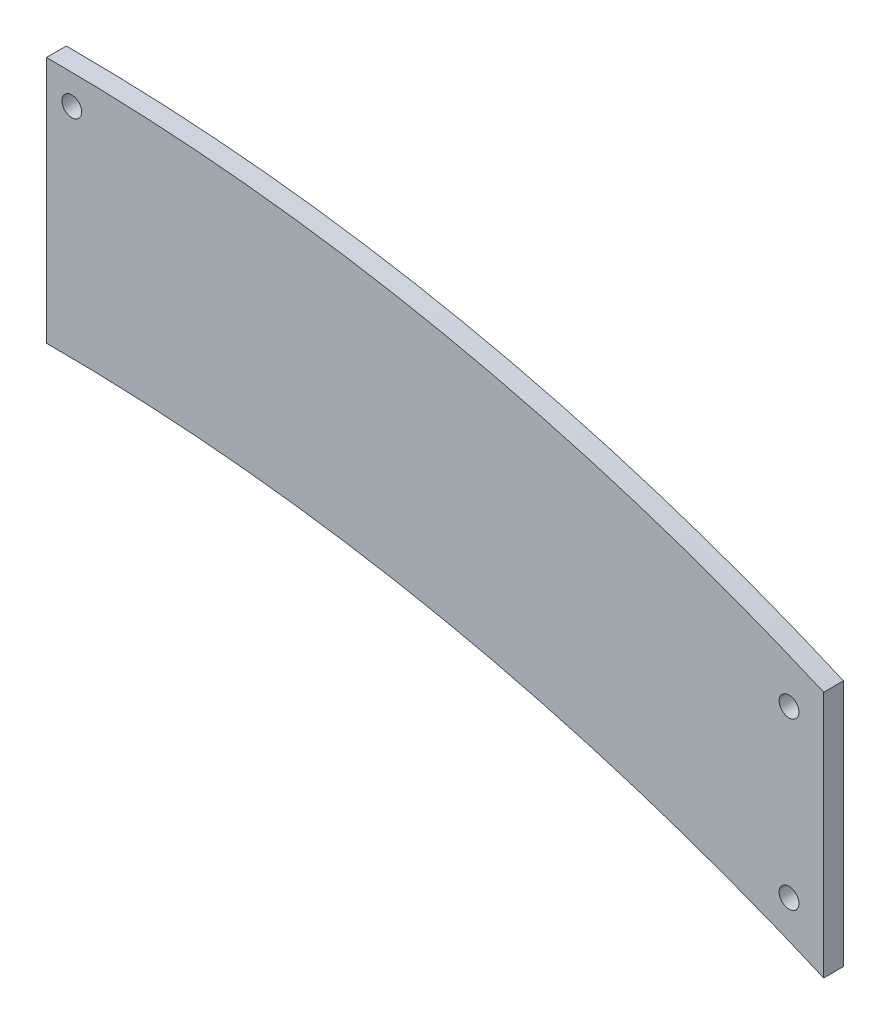
ISO-10303-21;
HEADER;
FILE_DESCRIPTION(('STEP AP214'),'2;1');
FILE_NAME('part.step','',(''),(''),'','','');
FILE_SCHEMA(('AUTOMOTIVE_DESIGN { 1 0 10303 214 1 1 1 1 }'));
ENDSEC;
DATA;
#1=APPLICATION_CONTEXT('core data for automotive mechanical design processes');
#2=APPLICATION_PROTOCOL_DEFINITION('international standard','automotive_design',2000,#1);
#3=PRODUCT_CONTEXT('',#1,'mechanical');
#4=PRODUCT('Part','Part','',(#3));
#5=PRODUCT_RELATED_PRODUCT_CATEGORY('part','',(#4));
#6=PRODUCT_DEFINITION_FORMATION('','',#4);
#7=PRODUCT_DEFINITION_CONTEXT('part definition',#1,'design');
#8=PRODUCT_DEFINITION('design','',#6,#7);
#9=PRODUCT_DEFINITION_SHAPE('','',#8);
#10=(LENGTH_UNIT() NAMED_UNIT(*) SI_UNIT(.MILLI.,.METRE.));
#11=(NAMED_UNIT(*) PLANE_ANGLE_UNIT() SI_UNIT($,.RADIAN.));
#12=(NAMED_UNIT(*) SI_UNIT($,.STERADIAN.) SOLID_ANGLE_UNIT());
#13=UNCERTAINTY_MEASURE_WITH_UNIT(LENGTH_MEASURE(1.E-05),#10,'distance_accuracy_value','');
#14=(GEOMETRIC_REPRESENTATION_CONTEXT(3) GLOBAL_UNCERTAINTY_ASSIGNED_CONTEXT((#13)) GLOBAL_UNIT_ASSIGNED_CONTEXT((#10,
#11,#12)) REPRESENTATION_CONTEXT('',''));
#15=CARTESIAN_POINT('',(0.,0.,0.));
#16=DIRECTION('',(0.,0.,1.));
#17=DIRECTION('',(1.,0.,0.));
#18=AXIS2_PLACEMENT_3D('',#15,#16,#17);
#19=CARTESIAN_POINT('',(0.,-156.923981731967,2.));
#20=DIRECTION('',(0.,0.,-1.));
#21=DIRECTION('',(-1.,0.,0.));
#22=AXIS2_PLACEMENT_3D('',#19,#20,#21);
#23=PLANE('',#22);
#24=CARTESIAN_POINT('',(75.,21.2338937231617,2.));
#25=DIRECTION('',(0.,0.,1.));
#26=DIRECTION('',(1.,0.,0.));
#27=AXIS2_PLACEMENT_3D('',#24,#25,#26);
#28=CIRCLE('',#27,0.999999999999998);
#29=CARTESIAN_POINT('',(76.,21.2338937231617,2.));
#30=VERTEX_POINT('',#29);
#31=EDGE_CURVE('E115',#30,#30,#28,.T.);
#32=ORIENTED_EDGE('',*,*,#31,.F.);
#33=EDGE_LOOP('',(#32));
#34=FACE_BOUND('',#33,.T.);
#35=CARTESIAN_POINT('',(0.,-156.923981731967,2.));
#36=DIRECTION('',(0.,0.,1.));
#37=DIRECTION('',(-1.,0.,0.));
#38=AXIS2_PLACEMENT_3D('',#35,#36,#37);
#39=CIRCLE('',#38,197.43461155384);
#40=CARTESIAN_POINT('',(78.5,24.2338937231617,2.));
#41=VERTEX_POINT('',#40);
#42=CARTESIAN_POINT('',(0.,40.5106298218736,2.));
#43=VERTEX_POINT('',#42);
#44=EDGE_CURVE('E85',#41,#43,#39,.T.);
#45=ORIENTED_EDGE('',*,*,#44,.T.);
#46=DIRECTION('',(0.,-1.,0.));
#47=VECTOR('',#46,1.);
#48=CARTESIAN_POINT('',(0.,40.5106298218736,2.));
#49=LINE('',#48,#47);
#50=CARTESIAN_POINT('',(0.,15.5106298218736,2.));
#51=VERTEX_POINT('',#50);
#52=EDGE_CURVE('E80',#43,#51,#49,.T.);
#53=ORIENTED_EDGE('',*,*,#52,.T.);
#54=CARTESIAN_POINT('',(0.,-181.923981731967,2.));
#55=DIRECTION('',(0.,0.,-1.));
#56=DIRECTION('',(-1.,0.,0.));
#57=AXIS2_PLACEMENT_3D('',#54,#55,#56);
#58=CIRCLE('',#57,197.43461155384);
#59=CARTESIAN_POINT('',(78.5,-0.766106276838346,2.));
#60=VERTEX_POINT('',#59);
#61=EDGE_CURVE('E83',#51,#60,#58,.T.);
#62=ORIENTED_EDGE('',*,*,#61,.T.);
#63=DIRECTION('',(0.,1.,0.));
#64=VECTOR('',#63,1.);
#65=CARTESIAN_POINT('',(78.5,24.2338937231617,2.));
#66=LINE('',#65,#64);
#67=EDGE_CURVE('E50',#60,#41,#66,.T.);
#68=ORIENTED_EDGE('',*,*,#67,.T.);
#69=EDGE_LOOP('',(#45,#53,#62,#68));
#70=FACE_BOUND('',#69,.T.);
#71=CARTESIAN_POINT('',(2.55518808937818,37.5106298218736,2.));
#72=DIRECTION('',(0.,0.,1.));
#73=DIRECTION('',(1.,0.,0.));
#74=AXIS2_PLACEMENT_3D('',#71,#72,#73);
#75=CIRCLE('',#74,1.);
#76=CARTESIAN_POINT('',(3.55518808937818,37.5106298218736,2.));
#77=VERTEX_POINT('',#76);
#78=EDGE_CURVE('E100',#77,#77,#75,.T.);
#79=ORIENTED_EDGE('',*,*,#78,.F.);
#80=EDGE_LOOP('',(#79));
#81=FACE_BOUND('',#80,.T.);
#82=CARTESIAN_POINT('',(75.,4.49999999999999,2.));
#83=DIRECTION('',(0.,0.,1.));
#84=DIRECTION('',(1.,0.,0.));
#85=AXIS2_PLACEMENT_3D('',#82,#83,#84);
#86=CIRCLE('',#85,0.999999999999998);
#87=CARTESIAN_POINT('',(76.,4.49999999999999,2.));
#88=VERTEX_POINT('',#87);
#89=EDGE_CURVE('E121',#88,#88,#86,.T.);
#90=ORIENTED_EDGE('',*,*,#89,.F.);
#91=EDGE_LOOP('',(#90));
#92=FACE_BOUND('',#91,.T.);
#93=ADVANCED_FACE('F33',(#34,#70,#81,#92),#23,.F.);
#94=CARTESIAN_POINT('',(0.,-156.923981731967,0.));
#95=DIRECTION('',(0.,0.,-1.));
#96=DIRECTION('',(-1.,0.,0.));
#97=AXIS2_PLACEMENT_3D('',#94,#95,#96);
#98=PLANE('',#97);
#99=CARTESIAN_POINT('',(75.,21.2338937231617,0.));
#100=DIRECTION('',(0.,0.,1.));
#101=DIRECTION('',(1.,0.,0.));
#102=AXIS2_PLACEMENT_3D('',#99,#100,#101);
#103=CIRCLE('',#102,0.999999999999998);
#104=CARTESIAN_POINT('',(76.,21.2338937231617,0.));
#105=VERTEX_POINT('',#104);
#106=EDGE_CURVE('E118',#105,#105,#103,.T.);
#107=ORIENTED_EDGE('',*,*,#106,.T.);
#108=EDGE_LOOP('',(#107));
#109=FACE_BOUND('',#108,.T.);
#110=CARTESIAN_POINT('',(0.,-156.923981731967,0.));
#111=DIRECTION('',(0.,0.,1.));
#112=DIRECTION('',(-1.,0.,0.));
#113=AXIS2_PLACEMENT_3D('',#110,#111,#112);
#114=CIRCLE('',#113,197.43461155384);
#115=CARTESIAN_POINT('',(78.5,24.2338937231617,0.));
#116=VERTEX_POINT('',#115);
#117=CARTESIAN_POINT('',(0.,40.5106298218736,0.));
#118=VERTEX_POINT('',#117);
#119=EDGE_CURVE('E97',#116,#118,#114,.T.);
#120=ORIENTED_EDGE('',*,*,#119,.F.);
#121=DIRECTION('',(0.,1.,0.));
#122=VECTOR('',#121,1.);
#123=CARTESIAN_POINT('',(78.5,24.2338937231617,0.));
#124=LINE('',#123,#122);
#125=CARTESIAN_POINT('',(78.5,-0.766106276838346,0.));
#126=VERTEX_POINT('',#125);
#127=EDGE_CURVE('E73',#126,#116,#124,.T.);
#128=ORIENTED_EDGE('',*,*,#127,.F.);
#129=CARTESIAN_POINT('',(0.,-181.923981731967,0.));
#130=DIRECTION('',(0.,0.,-1.));
#131=DIRECTION('',(-1.,0.,0.));
#132=AXIS2_PLACEMENT_3D('',#129,#130,#131);
#133=CIRCLE('',#132,197.43461155384);
#134=CARTESIAN_POINT('',(0.,15.5106298218736,0.));
#135=VERTEX_POINT('',#134);
#136=EDGE_CURVE('E67',#135,#126,#133,.T.);
#137=ORIENTED_EDGE('',*,*,#136,.F.);
#138=DIRECTION('',(0.,-1.,0.));
#139=VECTOR('',#138,1.);
#140=CARTESIAN_POINT('',(0.,40.5106298218736,0.));
#141=LINE('',#140,#139);
#142=EDGE_CURVE('E89',#118,#135,#141,.T.);
#143=ORIENTED_EDGE('',*,*,#142,.F.);
#144=EDGE_LOOP('',(#120,#128,#137,#143));
#145=FACE_BOUND('',#144,.T.);
#146=CARTESIAN_POINT('',(2.55518808937818,37.5106298218736,0.));
#147=DIRECTION('',(0.,0.,1.));
#148=DIRECTION('',(1.,0.,0.));
#149=AXIS2_PLACEMENT_3D('',#146,#147,#148);
#150=CIRCLE('',#149,1.);
#151=CARTESIAN_POINT('',(3.55518808937818,37.5106298218736,0.));
#152=VERTEX_POINT('',#151);
#153=EDGE_CURVE('E112',#152,#152,#150,.T.);
#154=ORIENTED_EDGE('',*,*,#153,.T.);
#155=EDGE_LOOP('',(#154));
#156=FACE_BOUND('',#155,.T.);
#157=CARTESIAN_POINT('',(75.,4.49999999999999,0.));
#158=DIRECTION('',(0.,0.,1.));
#159=DIRECTION('',(1.,0.,0.));
#160=AXIS2_PLACEMENT_3D('',#157,#158,#159);
#161=CIRCLE('',#160,0.999999999999998);
#162=CARTESIAN_POINT('',(76.,4.49999999999999,0.));
#163=VERTEX_POINT('',#162);
#164=EDGE_CURVE('E124',#163,#163,#161,.T.);
#165=ORIENTED_EDGE('',*,*,#164,.T.);
#166=EDGE_LOOP('',(#165));
#167=FACE_BOUND('',#166,.T.);
#168=ADVANCED_FACE('F108',(#109,#145,#156,#167),#98,.T.);
#169=CARTESIAN_POINT('',(0.,-156.923981731967,2.));
#170=DIRECTION('',(0.,0.,-1.));
#171=DIRECTION('',(-1.,0.,0.));
#172=AXIS2_PLACEMENT_3D('',#169,#170,#171);
#173=CYLINDRICAL_SURFACE('',#172,197.43461155384);
#174=ORIENTED_EDGE('',*,*,#119,.T.);
#175=DIRECTION('',(0.,0.,-1.));
#176=VECTOR('',#175,1.);
#177=CARTESIAN_POINT('',(0.,40.5106298218736,2.));
#178=LINE('',#177,#176);
#179=EDGE_CURVE('E11',#43,#118,#178,.T.);
#180=ORIENTED_EDGE('',*,*,#179,.F.);
#181=ORIENTED_EDGE('',*,*,#44,.F.);
#182=DIRECTION('',(0.,0.,-1.));
#183=VECTOR('',#182,1.);
#184=CARTESIAN_POINT('',(78.5,24.2338937231617,2.));
#185=LINE('',#184,#183);
#186=EDGE_CURVE('E93',#41,#116,#185,.T.);
#187=ORIENTED_EDGE('',*,*,#186,.T.);
#188=EDGE_LOOP('',(#174,#180,#181,#187));
#189=FACE_BOUND('',#188,.T.);
#190=ADVANCED_FACE('F35',(#189),#173,.T.);
#191=CARTESIAN_POINT('',(0.,40.5106298218736,2.));
#192=DIRECTION('',(1.,0.,0.));
#193=DIRECTION('',(0.,1.,0.));
#194=AXIS2_PLACEMENT_3D('',#191,#192,#193);
#195=PLANE('',#194);
#196=ORIENTED_EDGE('',*,*,#142,.T.);
#197=DIRECTION('',(0.,0.,-1.));
#198=VECTOR('',#197,1.);
#199=CARTESIAN_POINT('',(0.,15.5106298218736,2.));
#200=LINE('',#199,#198);
#201=EDGE_CURVE('E42',#51,#135,#200,.T.);
#202=ORIENTED_EDGE('',*,*,#201,.F.);
#203=ORIENTED_EDGE('',*,*,#52,.F.);
#204=ORIENTED_EDGE('',*,*,#179,.T.);
#205=EDGE_LOOP('',(#196,#202,#203,#204));
#206=FACE_BOUND('',#205,.T.);
#207=ADVANCED_FACE('F88',(#206),#195,.F.);
#208=CARTESIAN_POINT('',(0.,-181.923981731967,2.));
#209=DIRECTION('',(0.,0.,-1.));
#210=DIRECTION('',(-1.,0.,0.));
#211=AXIS2_PLACEMENT_3D('',#208,#209,#210);
#212=CYLINDRICAL_SURFACE('',#211,197.43461155384);
#213=ORIENTED_EDGE('',*,*,#136,.T.);
#214=DIRECTION('',(0.,0.,-1.));
#215=VECTOR('',#214,1.);
#216=CARTESIAN_POINT('',(78.5,-0.766106276838346,2.));
#217=LINE('',#216,#215);
#218=EDGE_CURVE('E90',#60,#126,#217,.T.);
#219=ORIENTED_EDGE('',*,*,#218,.F.);
#220=ORIENTED_EDGE('',*,*,#61,.F.);
#221=ORIENTED_EDGE('',*,*,#201,.T.);
#222=EDGE_LOOP('',(#213,#219,#220,#221));
#223=FACE_BOUND('',#222,.T.);
#224=ADVANCED_FACE('F91',(#223),#212,.F.);
#225=CARTESIAN_POINT('',(78.5,24.2338937231617,2.));
#226=DIRECTION('',(-1.,0.,0.));
#227=DIRECTION('',(0.,0.,1.));
#228=AXIS2_PLACEMENT_3D('',#225,#226,#227);
#229=PLANE('',#228);
#230=ORIENTED_EDGE('',*,*,#127,.T.);
#231=ORIENTED_EDGE('',*,*,#186,.F.);
#232=ORIENTED_EDGE('',*,*,#67,.F.);
#233=ORIENTED_EDGE('',*,*,#218,.T.);
#234=EDGE_LOOP('',(#230,#231,#232,#233));
#235=FACE_BOUND('',#234,.T.);
#236=ADVANCED_FACE('F105',(#235),#229,.F.);
#237=CARTESIAN_POINT('',(2.55518808937818,37.5106298218736,2.));
#238=DIRECTION('',(0.,0.,-1.));
#239=DIRECTION('',(-1.,0.,0.));
#240=AXIS2_PLACEMENT_3D('',#237,#238,#239);
#241=CYLINDRICAL_SURFACE('',#240,1.);
#242=ORIENTED_EDGE('',*,*,#78,.T.);
#243=EDGE_LOOP('',(#242));
#244=FACE_BOUND('',#243,.T.);
#245=ORIENTED_EDGE('',*,*,#153,.F.);
#246=EDGE_LOOP('',(#245));
#247=FACE_BOUND('',#246,.T.);
#248=ADVANCED_FACE('F143',(#244,#247),#241,.F.);
#249=CARTESIAN_POINT('',(75.,21.2338937231617,2.));
#250=DIRECTION('',(0.,0.,-1.));
#251=DIRECTION('',(-1.,0.,0.));
#252=AXIS2_PLACEMENT_3D('',#249,#250,#251);
#253=CYLINDRICAL_SURFACE('',#252,0.999999999999998);
#254=ORIENTED_EDGE('',*,*,#31,.T.);
#255=EDGE_LOOP('',(#254));
#256=FACE_BOUND('',#255,.T.);
#257=ORIENTED_EDGE('',*,*,#106,.F.);
#258=EDGE_LOOP('',(#257));
#259=FACE_BOUND('',#258,.T.);
#260=ADVANCED_FACE('F189',(#256,#259),#253,.F.);
#261=CARTESIAN_POINT('',(75.,4.49999999999999,2.));
#262=DIRECTION('',(0.,0.,-1.));
#263=DIRECTION('',(-1.,0.,0.));
#264=AXIS2_PLACEMENT_3D('',#261,#262,#263);
#265=CYLINDRICAL_SURFACE('',#264,0.999999999999998);
#266=ORIENTED_EDGE('',*,*,#89,.T.);
#267=EDGE_LOOP('',(#266));
#268=FACE_BOUND('',#267,.T.);
#269=ORIENTED_EDGE('',*,*,#164,.F.);
#270=EDGE_LOOP('',(#269));
#271=FACE_BOUND('',#270,.T.);
#272=ADVANCED_FACE('F130',(#268,#271),#265,.F.);
#273=CLOSED_SHELL('',(#93,#168,#190,#207,#224,#236,#248,#260,#272));
#274=MANIFOLD_SOLID_BREP('B2',#273);
#275=ADVANCED_BREP_SHAPE_REPRESENTATION('',(#18,#274),#14);
#276=SHAPE_DEFINITION_REPRESENTATION(#9,#275);
ENDSEC;
END-ISO-10303-21;
